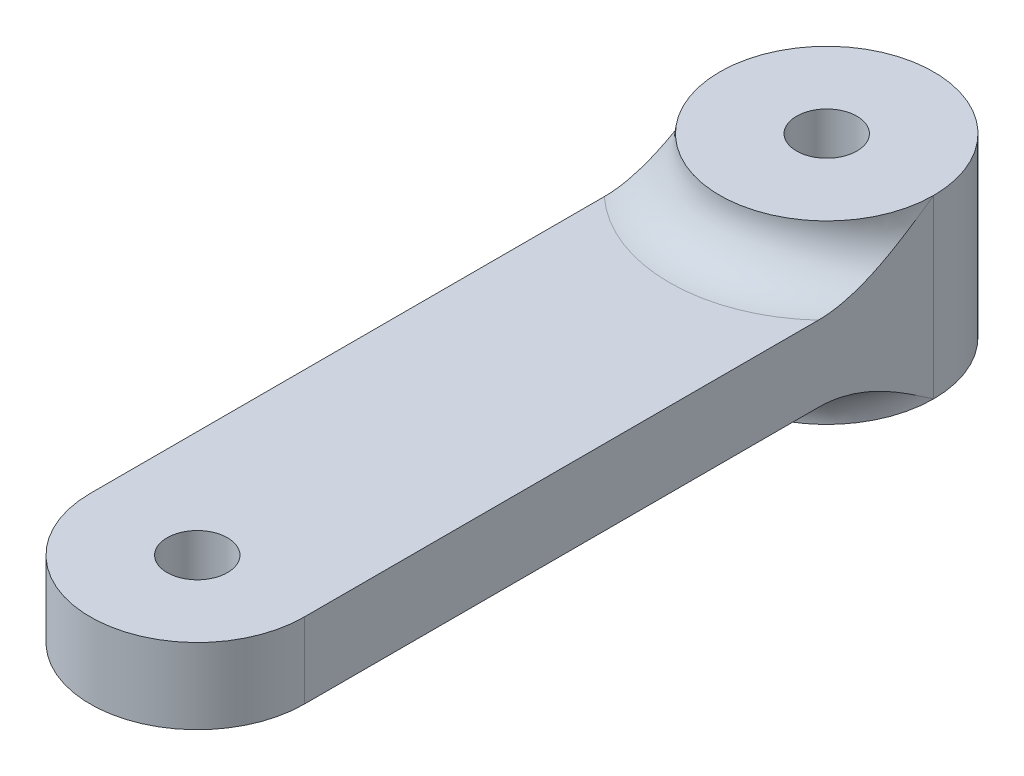
ISO-10303-21;
HEADER;
FILE_DESCRIPTION(('STEP AP214'),'2;1');
FILE_NAME('part.step','',(''),(''),'','','');
FILE_SCHEMA(('AUTOMOTIVE_DESIGN { 1 0 10303 214 1 1 1 1 }'));
ENDSEC;
DATA;
#1=APPLICATION_CONTEXT('core data for automotive mechanical design processes');
#2=APPLICATION_PROTOCOL_DEFINITION('international standard','automotive_design',2000,#1);
#3=PRODUCT_CONTEXT('',#1,'mechanical');
#4=PRODUCT('Part','Part','',(#3));
#5=PRODUCT_RELATED_PRODUCT_CATEGORY('part','',(#4));
#6=PRODUCT_DEFINITION_FORMATION('','',#4);
#7=PRODUCT_DEFINITION_CONTEXT('part definition',#1,'design');
#8=PRODUCT_DEFINITION('design','',#6,#7);
#9=PRODUCT_DEFINITION_SHAPE('','',#8);
#10=(LENGTH_UNIT() NAMED_UNIT(*) SI_UNIT(.MILLI.,.METRE.));
#11=(NAMED_UNIT(*) PLANE_ANGLE_UNIT() SI_UNIT($,.RADIAN.));
#12=(NAMED_UNIT(*) SI_UNIT($,.STERADIAN.) SOLID_ANGLE_UNIT());
#13=UNCERTAINTY_MEASURE_WITH_UNIT(LENGTH_MEASURE(1.E-05),#10,'distance_accuracy_value','');
#14=(GEOMETRIC_REPRESENTATION_CONTEXT(3) GLOBAL_UNCERTAINTY_ASSIGNED_CONTEXT((#13)) GLOBAL_UNIT_ASSIGNED_CONTEXT((#10,
#11,#12)) REPRESENTATION_CONTEXT('',''));
#15=CARTESIAN_POINT('',(0.,0.,0.));
#16=DIRECTION('',(0.,0.,1.));
#17=DIRECTION('',(1.,0.,0.));
#18=AXIS2_PLACEMENT_3D('',#15,#16,#17);
#19=CARTESIAN_POINT('',(-4.25,7.,0.));
#20=DIRECTION('',(1.,0.,0.));
#21=DIRECTION('',(0.,0.,-1.));
#22=AXIS2_PLACEMENT_3D('',#19,#20,#21);
#23=PLANE('',#22);
#24=DIRECTION('',(0.,-1.,0.));
#25=VECTOR('',#24,1.);
#26=CARTESIAN_POINT('',(-4.25,7.,0.));
#27=LINE('',#26,#25);
#28=CARTESIAN_POINT('',(-4.25,7.,0.));
#29=VERTEX_POINT('',#28);
#30=CARTESIAN_POINT('',(-4.25,0.,0.));
#31=VERTEX_POINT('',#30);
#32=EDGE_CURVE('E126',#29,#31,#27,.T.);
#33=ORIENTED_EDGE('',*,*,#32,.T.);
#34=CARTESIAN_POINT('',(-4.25,2.,4.58257569495584));
#35=CARTESIAN_POINT('',(-4.25,1.99998688464663,4.45960837090995));
#36=CARTESIAN_POINT('',(-4.25,1.99390739066706,4.33678989084442));
#37=CARTESIAN_POINT('',(-4.25,1.9709374874443,4.09239325070744));
#38=CARTESIAN_POINT('',(-4.25,1.95406833528218,3.9708131283253));
#39=CARTESIAN_POINT('',(-4.25,1.88998929315085,3.61295615021055));
#40=CARTESIAN_POINT('',(-4.25,1.82920745089563,3.37910013351294));
#41=CARTESIAN_POINT('',(-4.25,1.66203583419861,2.86587285374921));
#42=CARTESIAN_POINT('',(-4.25,1.54820612797429,2.58902802810458));
#43=CARTESIAN_POINT('',(-4.25,1.29159915879516,2.04890584393305));
#44=CARTESIAN_POINT('',(-4.25,1.14876117032504,1.78565842448626));
#45=CARTESIAN_POINT('',(-4.25,0.843895574333288,1.26738027210675));
#46=CARTESIAN_POINT('',(-4.25,0.681696127299819,1.01245331299622));
#47=CARTESIAN_POINT('',(-4.25,0.348803412442042,0.508588993195813));
#48=CARTESIAN_POINT('',(-4.25,0.178115736258345,0.259647845590494));
#49=CARTESIAN_POINT('',(-4.25,0.00491708866779176,0.00716782860595629));
#50=CARTESIAN_POINT('',(-4.25,0.00245854343618957,0.00358391390749879));
#51=CARTESIAN_POINT('',(-4.25,0.,0.));
#52=B_SPLINE_CURVE_WITH_KNOTS('',3,(#34,#35,#36,#37,#38,#39,#40,#41,#42,#43,#44,#45,#46,#47,#48,
#49,#50,#51),.UNSPECIFIED.,.F.,.F.,(4,2,2,2,2,2,2,2,4),(0.,0.368524224387158,0.736324633419816,
1.45869867286765,2.35422565712451,3.25164701501249,4.15772636567725,5.06321654327689,
5.07625494808727),.UNSPECIFIED.);
#53=CARTESIAN_POINT('',(-4.25,2.,4.58257569495584));
#54=VERTEX_POINT('',#53);
#55=EDGE_CURVE('E11',#31,#54,#52,.F.);
#56=ORIENTED_EDGE('',*,*,#55,.T.);
#57=DIRECTION('',(0.,0.,-1.));
#58=VECTOR('',#57,1.);
#59=CARTESIAN_POINT('',(-4.25,2.,0.));
#60=LINE('',#59,#58);
#61=CARTESIAN_POINT('',(-4.25,2.,25.));
#62=VERTEX_POINT('',#61);
#63=EDGE_CURVE('E106',#62,#54,#60,.T.);
#64=ORIENTED_EDGE('',*,*,#63,.F.);
#65=DIRECTION('',(0.,-1.,0.));
#66=VECTOR('',#65,1.);
#67=CARTESIAN_POINT('',(-4.25,7.,25.));
#68=LINE('',#67,#66);
#69=CARTESIAN_POINT('',(-4.25,5.,25.));
#70=VERTEX_POINT('',#69);
#71=EDGE_CURVE('E119',#70,#62,#68,.T.);
#72=ORIENTED_EDGE('',*,*,#71,.F.);
#73=DIRECTION('',(0.,0.,1.));
#74=VECTOR('',#73,1.);
#75=CARTESIAN_POINT('',(-4.25,5.,0.));
#76=LINE('',#75,#74);
#77=CARTESIAN_POINT('',(-4.25,5.,4.58257569495584));
#78=VERTEX_POINT('',#77);
#79=EDGE_CURVE('E114',#78,#70,#76,.T.);
#80=ORIENTED_EDGE('',*,*,#79,.F.);
#81=CARTESIAN_POINT('',(-4.25,5.,4.58257569495584));
#82=CARTESIAN_POINT('',(-4.25,5.00001311535337,4.45960837090991));
#83=CARTESIAN_POINT('',(-4.25,5.00609260933294,4.33678989084432));
#84=CARTESIAN_POINT('',(-4.25,5.02906251255572,4.09239325070725));
#85=CARTESIAN_POINT('',(-4.25,5.04593166471785,3.97081312832507));
#86=CARTESIAN_POINT('',(-4.25,5.1100107068492,3.61295615021038));
#87=CARTESIAN_POINT('',(-4.25,5.17079254910441,3.37910013351286));
#88=CARTESIAN_POINT('',(-4.25,5.33796416580138,2.86587285374922));
#89=CARTESIAN_POINT('',(-4.25,5.45179387202567,2.58902802810459));
#90=CARTESIAN_POINT('',(-4.25,5.70840084120482,2.04890584393316));
#91=CARTESIAN_POINT('',(-4.25,5.85123882967498,1.78565842448646));
#92=CARTESIAN_POINT('',(-4.25,6.15610442566652,1.26738027210684));
#93=CARTESIAN_POINT('',(-4.25,6.31830387269974,1.0124533129961));
#94=CARTESIAN_POINT('',(-4.25,6.65119658755828,0.50858899319612));
#95=CARTESIAN_POINT('',(-4.25,6.82188426374298,0.259647845591433));
#96=CARTESIAN_POINT('',(-4.25,6.99508291133225,0.00716782860597118));
#97=CARTESIAN_POINT('',(-4.25,6.99754145656383,0.0035839139075064));
#98=CARTESIAN_POINT('',(-4.25,7.,0.));
#99=B_SPLINE_CURVE_WITH_KNOTS('',3,(#81,#82,#83,#84,#85,#86,#87,#88,#89,#90,#91,#92,#93,#94,#95,
#96,#97,#98),.UNSPECIFIED.,.F.,.F.,(4,2,2,2,2,2,2,2,4),(0.,0.368524224387311,0.736324633420089,
1.45869867286765,2.35422565712447,3.25164701501228,4.15772636567713,5.06321654327691,
5.07625494808727),.UNSPECIFIED.);
#100=EDGE_CURVE('E148',#78,#29,#99,.T.);
#101=ORIENTED_EDGE('',*,*,#100,.T.);
#102=EDGE_LOOP('',(#33,#56,#64,#72,#80,#101));
#103=FACE_BOUND('',#102,.T.);
#104=ADVANCED_FACE('F45',(#103),#23,.F.);
#105=CARTESIAN_POINT('',(0.,7.,25.));
#106=DIRECTION('',(0.,-1.,0.));
#107=DIRECTION('',(0.,0.,-1.));
#108=AXIS2_PLACEMENT_3D('',#105,#106,#107);
#109=CYLINDRICAL_SURFACE('',#108,4.25);
#110=CARTESIAN_POINT('',(0.,2.,25.));
#111=DIRECTION('',(0.,1.,0.));
#112=DIRECTION('',(0.,0.,1.));
#113=AXIS2_PLACEMENT_3D('',#110,#111,#112);
#114=CIRCLE('',#113,4.25);
#115=CARTESIAN_POINT('',(4.25,2.,25.));
#116=VERTEX_POINT('',#115);
#117=EDGE_CURVE('E104',#62,#116,#114,.T.);
#118=ORIENTED_EDGE('',*,*,#117,.T.);
#119=DIRECTION('',(0.,-1.,0.));
#120=VECTOR('',#119,1.);
#121=CARTESIAN_POINT('',(4.25,7.,25.));
#122=LINE('',#121,#120);
#123=CARTESIAN_POINT('',(4.25,5.,25.));
#124=VERTEX_POINT('',#123);
#125=EDGE_CURVE('E127',#124,#116,#122,.T.);
#126=ORIENTED_EDGE('',*,*,#125,.F.);
#127=CARTESIAN_POINT('',(0.,5.,25.));
#128=DIRECTION('',(0.,1.,0.));
#129=DIRECTION('',(0.,0.,1.));
#130=AXIS2_PLACEMENT_3D('',#127,#128,#129);
#131=CIRCLE('',#130,4.25);
#132=EDGE_CURVE('E124',#70,#124,#131,.T.);
#133=ORIENTED_EDGE('',*,*,#132,.F.);
#134=ORIENTED_EDGE('',*,*,#71,.T.);
#135=EDGE_LOOP('',(#118,#126,#133,#134));
#136=FACE_BOUND('',#135,.T.);
#137=ADVANCED_FACE('F123',(#136),#109,.T.);
#138=CARTESIAN_POINT('',(4.25,7.,0.));
#139=DIRECTION('',(-1.,0.,0.));
#140=DIRECTION('',(0.,0.,1.));
#141=AXIS2_PLACEMENT_3D('',#138,#139,#140);
#142=PLANE('',#141);
#143=ORIENTED_EDGE('',*,*,#125,.T.);
#144=DIRECTION('',(0.,0.,1.));
#145=VECTOR('',#144,1.);
#146=CARTESIAN_POINT('',(4.25,2.,29.25));
#147=LINE('',#146,#145);
#148=CARTESIAN_POINT('',(4.25,2.,4.58257569495584));
#149=VERTEX_POINT('',#148);
#150=EDGE_CURVE('E108',#149,#116,#147,.T.);
#151=ORIENTED_EDGE('',*,*,#150,.F.);
#152=CARTESIAN_POINT('',(4.25,2.,4.58257569495584));
#153=CARTESIAN_POINT('',(4.25,1.99998688464663,4.45960837090995));
#154=CARTESIAN_POINT('',(4.25,1.99390739066706,4.33678989084442));
#155=CARTESIAN_POINT('',(4.25,1.9709374874443,4.09239325070744));
#156=CARTESIAN_POINT('',(4.25,1.95406833528218,3.97081312832529));
#157=CARTESIAN_POINT('',(4.25,1.88998929315084,3.61295615021055));
#158=CARTESIAN_POINT('',(4.25,1.82920745089563,3.37910013351294));
#159=CARTESIAN_POINT('',(4.25,1.66203583419861,2.86587285374921));
#160=CARTESIAN_POINT('',(4.25,1.5482061279743,2.58902802810458));
#161=CARTESIAN_POINT('',(4.25,1.29159915879516,2.04890584393305));
#162=CARTESIAN_POINT('',(4.25,1.14876117032504,1.78565842448626));
#163=CARTESIAN_POINT('',(4.25,0.843895574333291,1.26738027210675));
#164=CARTESIAN_POINT('',(4.25,0.681696127299827,1.01245331299622));
#165=CARTESIAN_POINT('',(4.25,0.348803412442036,0.508588993195817));
#166=CARTESIAN_POINT('',(4.25,0.178115736258322,0.259647845590509));
#167=CARTESIAN_POINT('',(4.25,0.00491708866779073,0.00716782860595504));
#168=CARTESIAN_POINT('',(4.25,0.00245854343618905,0.00358391390749757));
#169=CARTESIAN_POINT('',(4.25,0.,0.));
#170=B_SPLINE_CURVE_WITH_KNOTS('',3,(#152,#153,#154,#155,#156,#157,#158,#159,#160,#161,#162,
#163,#164,#165,#166,#167,#168,#169),.UNSPECIFIED.,.F.,.F.,(4,2,2,2,2,2,2,2,4),(0.,
0.368524224387159,0.736324633419821,1.45869867286765,2.35422565712451,3.25164701501249,
4.15772636567725,5.06321654327689,5.07625494808727),.UNSPECIFIED.);
#171=CARTESIAN_POINT('',(4.25,0.,0.));
#172=VERTEX_POINT('',#171);
#173=EDGE_CURVE('E60',#149,#172,#170,.T.);
#174=ORIENTED_EDGE('',*,*,#173,.T.);
#175=DIRECTION('',(0.,-1.,0.));
#176=VECTOR('',#175,1.);
#177=CARTESIAN_POINT('',(4.25,7.,0.));
#178=LINE('',#177,#176);
#179=CARTESIAN_POINT('',(4.25,7.,0.));
#180=VERTEX_POINT('',#179);
#181=EDGE_CURVE('E133',#180,#172,#178,.T.);
#182=ORIENTED_EDGE('',*,*,#181,.F.);
#183=CARTESIAN_POINT('',(4.25,5.,4.58257569495584));
#184=CARTESIAN_POINT('',(4.25,5.00001311535337,4.45960837090991));
#185=CARTESIAN_POINT('',(4.25,5.00609260933294,4.33678989084432));
#186=CARTESIAN_POINT('',(4.25,5.02906251255572,4.09239325070726));
#187=CARTESIAN_POINT('',(4.25,5.04593166471785,3.97081312832508));
#188=CARTESIAN_POINT('',(4.25,5.1100107068492,3.61295615021039));
#189=CARTESIAN_POINT('',(4.25,5.17079254910441,3.37910013351286));
#190=CARTESIAN_POINT('',(4.25,5.33796416580138,2.86587285374922));
#191=CARTESIAN_POINT('',(4.25,5.45179387202567,2.58902802810459));
#192=CARTESIAN_POINT('',(4.25,5.70840084120482,2.04890584393315));
#193=CARTESIAN_POINT('',(4.25,5.85123882967498,1.78565842448644));
#194=CARTESIAN_POINT('',(4.25,6.15610442566653,1.26738027210683));
#195=CARTESIAN_POINT('',(4.25,6.31830387269977,1.01245331299611));
#196=CARTESIAN_POINT('',(4.25,6.65119658755825,0.5085889931961));
#197=CARTESIAN_POINT('',(4.25,6.8218842637429,0.259647845591376));
#198=CARTESIAN_POINT('',(4.25,6.99508291133225,0.00716782860596929));
#199=CARTESIAN_POINT('',(4.25,6.99754145656383,0.00358391390750485));
#200=CARTESIAN_POINT('',(4.25,7.,0.));
#201=B_SPLINE_CURVE_WITH_KNOTS('',3,(#183,#184,#185,#186,#187,#188,#189,#190,#191,#192,#193,
#194,#195,#196,#197,#198,#199,#200),.UNSPECIFIED.,.F.,.F.,(4,2,2,2,2,2,2,2,4),(0.,
0.368524224387303,0.736324633420075,1.45869867286766,2.35422565712447,3.2516470150123,
4.15772636567713,5.06321654327691,5.07625494808727),.UNSPECIFIED.);
#202=CARTESIAN_POINT('',(4.25,5.,4.58257569495584));
#203=VERTEX_POINT('',#202);
#204=EDGE_CURVE('E156',#180,#203,#201,.F.);
#205=ORIENTED_EDGE('',*,*,#204,.T.);
#206=DIRECTION('',(0.,0.,-1.));
#207=VECTOR('',#206,1.);
#208=CARTESIAN_POINT('',(4.25,5.,29.25));
#209=LINE('',#208,#207);
#210=EDGE_CURVE('E141',#124,#203,#209,.T.);
#211=ORIENTED_EDGE('',*,*,#210,.F.);
#212=EDGE_LOOP('',(#143,#151,#174,#182,#205,#211));
#213=FACE_BOUND('',#212,.T.);
#214=ADVANCED_FACE('F192',(#213),#142,.F.);
#215=CARTESIAN_POINT('',(0.,7.,25.));
#216=DIRECTION('',(0.,-1.,0.));
#217=DIRECTION('',(0.,0.,-1.));
#218=AXIS2_PLACEMENT_3D('',#215,#216,#217);
#219=CYLINDRICAL_SURFACE('',#218,1.2);
#220=CARTESIAN_POINT('',(0.,2.,25.));
#221=DIRECTION('',(0.,1.,0.));
#222=DIRECTION('',(0.,0.,1.));
#223=AXIS2_PLACEMENT_3D('',#220,#221,#222);
#224=CIRCLE('',#223,1.2);
#225=CARTESIAN_POINT('',(0.,2.,26.2));
#226=VERTEX_POINT('',#225);
#227=EDGE_CURVE('E115',#226,#226,#224,.T.);
#228=ORIENTED_EDGE('',*,*,#227,.F.);
#229=EDGE_LOOP('',(#228));
#230=FACE_BOUND('',#229,.T.);
#231=CARTESIAN_POINT('',(0.,5.,25.));
#232=DIRECTION('',(0.,1.,0.));
#233=DIRECTION('',(0.,0.,1.));
#234=AXIS2_PLACEMENT_3D('',#231,#232,#233);
#235=CIRCLE('',#234,1.2);
#236=CARTESIAN_POINT('',(0.,5.,26.2));
#237=VERTEX_POINT('',#236);
#238=EDGE_CURVE('E137',#237,#237,#235,.T.);
#239=ORIENTED_EDGE('',*,*,#238,.T.);
#240=EDGE_LOOP('',(#239));
#241=FACE_BOUND('',#240,.T.);
#242=ADVANCED_FACE('F195',(#230,#241),#219,.F.);
#243=CARTESIAN_POINT('',(0.,7.,0.));
#244=DIRECTION('',(0.,1.,0.));
#245=DIRECTION('',(0.,0.,1.));
#246=AXIS2_PLACEMENT_3D('',#243,#244,#245);
#247=PLANE('',#246);
#248=CARTESIAN_POINT('',(0.,7.,0.));
#249=DIRECTION('',(0.,1.,0.));
#250=DIRECTION('',(0.,0.,1.));
#251=AXIS2_PLACEMENT_3D('',#248,#249,#250);
#252=CIRCLE('',#251,4.25);
#253=EDGE_CURVE('E221',#180,#29,#252,.T.);
#254=ORIENTED_EDGE('',*,*,#253,.T.);
#255=EDGE_CURVE('E216',#29,#180,#252,.T.);
#256=ORIENTED_EDGE('',*,*,#255,.T.);
#257=EDGE_LOOP('',(#254,#256));
#258=FACE_BOUND('',#257,.T.);
#259=CARTESIAN_POINT('',(0.,7.,0.));
#260=DIRECTION('',(0.,1.,0.));
#261=DIRECTION('',(0.,0.,1.));
#262=AXIS2_PLACEMENT_3D('',#259,#260,#261);
#263=CIRCLE('',#262,1.2);
#264=CARTESIAN_POINT('',(0.,7.,1.2));
#265=VERTEX_POINT('',#264);
#266=EDGE_CURVE('E236',#265,#265,#263,.T.);
#267=ORIENTED_EDGE('',*,*,#266,.F.);
#268=EDGE_LOOP('',(#267));
#269=FACE_BOUND('',#268,.T.);
#270=ADVANCED_FACE('F183',(#258,#269),#247,.T.);
#271=CARTESIAN_POINT('',(0.,0.,0.));
#272=DIRECTION('',(0.,1.,0.));
#273=DIRECTION('',(0.,0.,1.));
#274=AXIS2_PLACEMENT_3D('',#271,#272,#273);
#275=PLANE('',#274);
#276=CARTESIAN_POINT('',(0.,0.,0.));
#277=DIRECTION('',(0.,1.,0.));
#278=DIRECTION('',(0.,0.,1.));
#279=AXIS2_PLACEMENT_3D('',#276,#277,#278);
#280=CIRCLE('',#279,4.25);
#281=EDGE_CURVE('E227',#172,#31,#280,.T.);
#282=ORIENTED_EDGE('',*,*,#281,.F.);
#283=EDGE_CURVE('E234',#31,#172,#280,.T.);
#284=ORIENTED_EDGE('',*,*,#283,.F.);
#285=EDGE_LOOP('',(#282,#284));
#286=FACE_BOUND('',#285,.T.);
#287=CARTESIAN_POINT('',(0.,0.,0.));
#288=DIRECTION('',(0.,1.,0.));
#289=DIRECTION('',(0.,0.,1.));
#290=AXIS2_PLACEMENT_3D('',#287,#288,#289);
#291=CIRCLE('',#290,1.2);
#292=CARTESIAN_POINT('',(0.,0.,1.2));
#293=VERTEX_POINT('',#292);
#294=EDGE_CURVE('E230',#293,#293,#291,.T.);
#295=ORIENTED_EDGE('',*,*,#294,.T.);
#296=EDGE_LOOP('',(#295));
#297=FACE_BOUND('',#296,.T.);
#298=ADVANCED_FACE('F173',(#286,#297),#275,.F.);
#299=CARTESIAN_POINT('',(0.,7.,0.));
#300=DIRECTION('',(0.,-1.,0.));
#301=DIRECTION('',(0.,0.,-1.));
#302=AXIS2_PLACEMENT_3D('',#299,#300,#301);
#303=CYLINDRICAL_SURFACE('',#302,4.25);
#304=ORIENTED_EDGE('',*,*,#32,.F.);
#305=ORIENTED_EDGE('',*,*,#253,.F.);
#306=ORIENTED_EDGE('',*,*,#181,.T.);
#307=ORIENTED_EDGE('',*,*,#281,.T.);
#308=EDGE_LOOP('',(#304,#305,#306,#307));
#309=FACE_BOUND('',#308,.T.);
#310=ADVANCED_FACE('F169',(#309),#303,.T.);
#311=CARTESIAN_POINT('',(0.,7.,0.));
#312=DIRECTION('',(0.,-1.,0.));
#313=DIRECTION('',(0.,0.,-1.));
#314=AXIS2_PLACEMENT_3D('',#311,#312,#313);
#315=CYLINDRICAL_SURFACE('',#314,1.2);
#316=ORIENTED_EDGE('',*,*,#266,.T.);
#317=EDGE_LOOP('',(#316));
#318=FACE_BOUND('',#317,.T.);
#319=ORIENTED_EDGE('',*,*,#294,.F.);
#320=EDGE_LOOP('',(#319));
#321=FACE_BOUND('',#320,.T.);
#322=ADVANCED_FACE('F172',(#318,#321),#315,.F.);
#323=CARTESIAN_POINT('',(0.,5.,0.));
#324=DIRECTION('',(0.,1.,0.));
#325=DIRECTION('',(0.,0.,1.));
#326=AXIS2_PLACEMENT_3D('',#323,#324,#325);
#327=PLANE('',#326);
#328=ORIENTED_EDGE('',*,*,#238,.F.);
#329=EDGE_LOOP('',(#328));
#330=FACE_BOUND('',#329,.T.);
#331=ORIENTED_EDGE('',*,*,#210,.T.);
#332=CARTESIAN_POINT('',(0.,5.,0.));
#333=DIRECTION('',(0.,1.,0.));
#334=DIRECTION('',(0.,0.,1.));
#335=AXIS2_PLACEMENT_3D('',#332,#333,#334);
#336=CIRCLE('',#335,6.25);
#337=EDGE_CURVE('E131',#203,#78,#336,.F.);
#338=ORIENTED_EDGE('',*,*,#337,.T.);
#339=ORIENTED_EDGE('',*,*,#79,.T.);
#340=ORIENTED_EDGE('',*,*,#132,.T.);
#341=EDGE_LOOP('',(#331,#338,#339,#340));
#342=FACE_BOUND('',#341,.T.);
#343=ADVANCED_FACE('F180',(#330,#342),#327,.T.);
#344=CARTESIAN_POINT('',(0.,2.,0.));
#345=DIRECTION('',(0.,1.,0.));
#346=DIRECTION('',(0.,0.,1.));
#347=AXIS2_PLACEMENT_3D('',#344,#345,#346);
#348=PLANE('',#347);
#349=ORIENTED_EDGE('',*,*,#227,.T.);
#350=EDGE_LOOP('',(#349));
#351=FACE_BOUND('',#350,.T.);
#352=ORIENTED_EDGE('',*,*,#63,.T.);
#353=CARTESIAN_POINT('',(0.,2.,0.));
#354=DIRECTION('',(0.,1.,0.));
#355=DIRECTION('',(0.,0.,1.));
#356=AXIS2_PLACEMENT_3D('',#353,#354,#355);
#357=CIRCLE('',#356,6.25);
#358=EDGE_CURVE('E145',#54,#149,#357,.T.);
#359=ORIENTED_EDGE('',*,*,#358,.T.);
#360=ORIENTED_EDGE('',*,*,#150,.T.);
#361=ORIENTED_EDGE('',*,*,#117,.F.);
#362=EDGE_LOOP('',(#352,#359,#360,#361));
#363=FACE_BOUND('',#362,.T.);
#364=ADVANCED_FACE('F105',(#351,#363),#348,.F.);
#365=CARTESIAN_POINT('',(0.,7.,0.));
#366=DIRECTION('',(0.,1.,0.));
#367=DIRECTION('',(0.,0.,1.));
#368=AXIS2_PLACEMENT_3D('',#365,#366,#367);
#369=TOROIDAL_SURFACE('',#368,6.25,2.);
#370=ORIENTED_EDGE('',*,*,#204,.F.);
#371=ORIENTED_EDGE('',*,*,#255,.F.);
#372=ORIENTED_EDGE('',*,*,#100,.F.);
#373=ORIENTED_EDGE('',*,*,#337,.F.);
#374=EDGE_LOOP('',(#370,#371,#372,#373));
#375=FACE_BOUND('',#374,.T.);
#376=ADVANCED_FACE('F165',(#375),#369,.F.);
#377=CARTESIAN_POINT('',(0.,0.,0.));
#378=DIRECTION('',(0.,1.,0.));
#379=DIRECTION('',(0.,0.,1.));
#380=AXIS2_PLACEMENT_3D('',#377,#378,#379);
#381=TOROIDAL_SURFACE('',#380,6.25,2.);
#382=ORIENTED_EDGE('',*,*,#55,.F.);
#383=ORIENTED_EDGE('',*,*,#283,.T.);
#384=ORIENTED_EDGE('',*,*,#173,.F.);
#385=ORIENTED_EDGE('',*,*,#358,.F.);
#386=EDGE_LOOP('',(#382,#383,#384,#385));
#387=FACE_BOUND('',#386,.T.);
#388=ADVANCED_FACE('F47',(#387),#381,.F.);
#389=CLOSED_SHELL('',(#104,#137,#214,#242,#270,#298,#310,#322,#343,#364,#376,#388));
#390=MANIFOLD_SOLID_BREP('B2',#389);
#391=ADVANCED_BREP_SHAPE_REPRESENTATION('',(#18,#390),#14);
#392=SHAPE_DEFINITION_REPRESENTATION(#9,#391);
ENDSEC;
END-ISO-10303-21;
